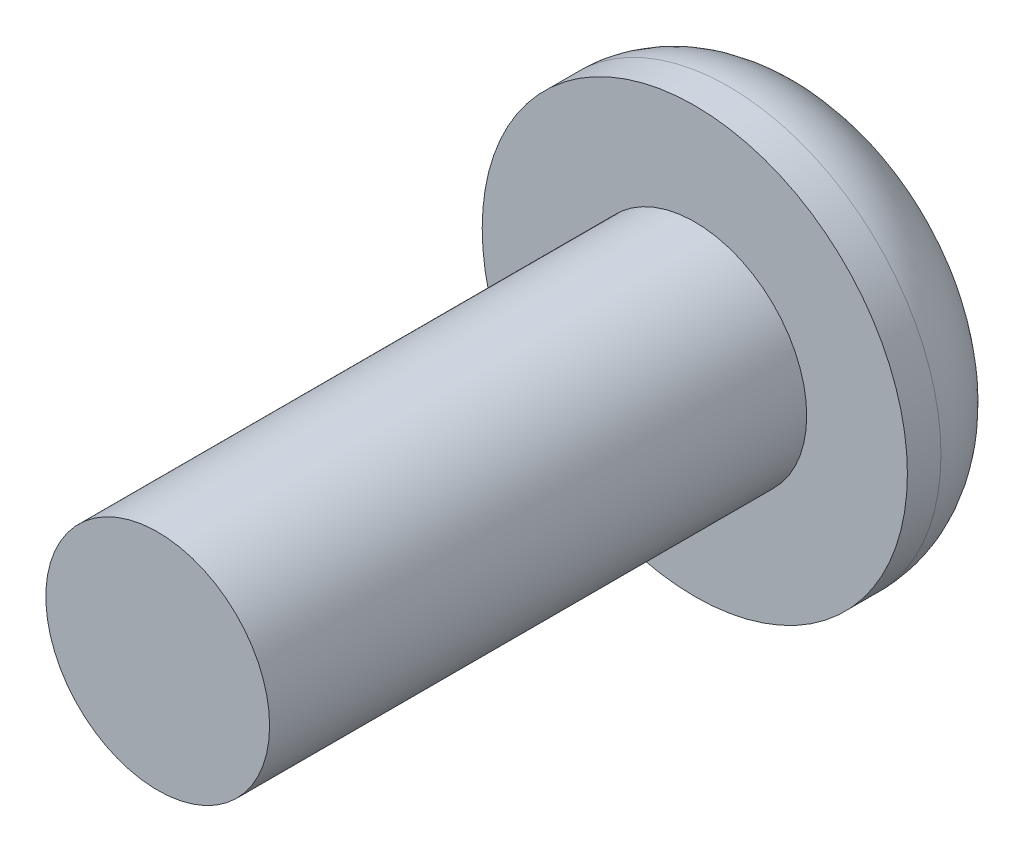
ISO-10303-21;
HEADER;
FILE_DESCRIPTION(('STEP AP214'),'2;1');
FILE_NAME('part.step','',(''),(''),'','','');
FILE_SCHEMA(('AUTOMOTIVE_DESIGN { 1 0 10303 214 1 1 1 1 }'));
ENDSEC;
DATA;
#1=APPLICATION_CONTEXT('core data for automotive mechanical design processes');
#2=APPLICATION_PROTOCOL_DEFINITION('international standard','automotive_design',2000,#1);
#3=PRODUCT_CONTEXT('',#1,'mechanical');
#4=PRODUCT('Part','Part','',(#3));
#5=PRODUCT_RELATED_PRODUCT_CATEGORY('part','',(#4));
#6=PRODUCT_DEFINITION_FORMATION('','',#4);
#7=PRODUCT_DEFINITION_CONTEXT('part definition',#1,'design');
#8=PRODUCT_DEFINITION('design','',#6,#7);
#9=PRODUCT_DEFINITION_SHAPE('','',#8);
#10=(LENGTH_UNIT() NAMED_UNIT(*) SI_UNIT(.MILLI.,.METRE.));
#11=(NAMED_UNIT(*) PLANE_ANGLE_UNIT() SI_UNIT($,.RADIAN.));
#12=(NAMED_UNIT(*) SI_UNIT($,.STERADIAN.) SOLID_ANGLE_UNIT());
#13=UNCERTAINTY_MEASURE_WITH_UNIT(LENGTH_MEASURE(1.E-05),#10,'distance_accuracy_value','');
#14=(GEOMETRIC_REPRESENTATION_CONTEXT(3) GLOBAL_UNCERTAINTY_ASSIGNED_CONTEXT((#13)) GLOBAL_UNIT_ASSIGNED_CONTEXT((#10,
#11,#12)) REPRESENTATION_CONTEXT('',''));
#15=CARTESIAN_POINT('',(0.,0.,0.));
#16=DIRECTION('',(0.,0.,1.));
#17=DIRECTION('',(1.,0.,0.));
#18=AXIS2_PLACEMENT_3D('',#15,#16,#17);
#19=CARTESIAN_POINT('',(0.,0.,12.));
#20=DIRECTION('',(0.,0.,-1.));
#21=DIRECTION('',(-1.,0.,0.));
#22=AXIS2_PLACEMENT_3D('',#19,#20,#21);
#23=CYLINDRICAL_SURFACE('',#22,2.5);
#24=CARTESIAN_POINT('',(0.,0.,12.));
#25=DIRECTION('',(0.,0.,1.));
#26=DIRECTION('',(1.,0.,0.));
#27=AXIS2_PLACEMENT_3D('',#24,#25,#26);
#28=CIRCLE('',#27,2.5);
#29=CARTESIAN_POINT('',(2.5,0.,12.));
#30=VERTEX_POINT('',#29);
#31=EDGE_CURVE('E50',#30,#30,#28,.T.);
#32=ORIENTED_EDGE('',*,*,#31,.F.);
#33=EDGE_LOOP('',(#32));
#34=FACE_BOUND('',#33,.T.);
#35=CARTESIAN_POINT('',(0.,0.,0.));
#36=DIRECTION('',(0.,0.,1.));
#37=DIRECTION('',(1.,0.,0.));
#38=AXIS2_PLACEMENT_3D('',#35,#36,#37);
#39=CIRCLE('',#38,2.5);
#40=CARTESIAN_POINT('',(2.5,0.,0.));
#41=VERTEX_POINT('',#40);
#42=EDGE_CURVE('E55',#41,#41,#39,.T.);
#43=ORIENTED_EDGE('',*,*,#42,.T.);
#44=EDGE_LOOP('',(#43));
#45=FACE_BOUND('',#44,.T.);
#46=ADVANCED_FACE('F37',(#34,#45),#23,.T.);
#47=CARTESIAN_POINT('',(0.,0.,12.));
#48=DIRECTION('',(0.,0.,1.));
#49=DIRECTION('',(1.,0.,0.));
#50=AXIS2_PLACEMENT_3D('',#47,#48,#49);
#51=PLANE('',#50);
#52=ORIENTED_EDGE('',*,*,#31,.T.);
#53=EDGE_LOOP('',(#52));
#54=FACE_BOUND('',#53,.T.);
#55=ADVANCED_FACE('F82',(#54),#51,.T.);
#56=CARTESIAN_POINT('',(0.,0.,-2.75));
#57=DIRECTION('',(0.,0.,1.));
#58=DIRECTION('',(1.,0.,0.));
#59=AXIS2_PLACEMENT_3D('',#56,#57,#58);
#60=CYLINDRICAL_SURFACE('',#59,4.75);
#61=CARTESIAN_POINT('',(0.,0.,-0.75));
#62=DIRECTION('',(0.,0.,-1.));
#63=DIRECTION('',(-1.,0.,0.));
#64=AXIS2_PLACEMENT_3D('',#61,#62,#63);
#65=CIRCLE('',#64,4.75);
#66=CARTESIAN_POINT('',(-4.75,0.,-0.75));
#67=VERTEX_POINT('',#66);
#68=EDGE_CURVE('E10',#67,#67,#65,.F.);
#69=ORIENTED_EDGE('',*,*,#68,.T.);
#70=EDGE_LOOP('',(#69));
#71=FACE_BOUND('',#70,.T.);
#72=CARTESIAN_POINT('',(0.,0.,0.));
#73=DIRECTION('',(0.,0.,-1.));
#74=DIRECTION('',(-1.,0.,0.));
#75=AXIS2_PLACEMENT_3D('',#72,#73,#74);
#76=CIRCLE('',#75,4.75);
#77=CARTESIAN_POINT('',(-4.75,0.,0.));
#78=VERTEX_POINT('',#77);
#79=EDGE_CURVE('E60',#78,#78,#76,.T.);
#80=ORIENTED_EDGE('',*,*,#79,.T.);
#81=EDGE_LOOP('',(#80));
#82=FACE_BOUND('',#81,.T.);
#83=ADVANCED_FACE('F66',(#71,#82),#60,.T.);
#84=CARTESIAN_POINT('',(0.,0.,-2.75));
#85=DIRECTION('',(0.,0.,-1.));
#86=DIRECTION('',(-1.,0.,0.));
#87=AXIS2_PLACEMENT_3D('',#84,#85,#86);
#88=PLANE('',#87);
#89=CARTESIAN_POINT('',(0.,0.,-2.75));
#90=DIRECTION('',(0.,0.,-1.));
#91=DIRECTION('',(-1.,0.,0.));
#92=AXIS2_PLACEMENT_3D('',#89,#90,#91);
#93=CIRCLE('',#92,2.75);
#94=CARTESIAN_POINT('',(-2.75,0.,-2.75));
#95=VERTEX_POINT('',#94);
#96=EDGE_CURVE('E45',#95,#95,#93,.T.);
#97=ORIENTED_EDGE('',*,*,#96,.T.);
#98=EDGE_LOOP('',(#97));
#99=FACE_BOUND('',#98,.T.);
#100=ADVANCED_FACE('F70',(#99),#88,.T.);
#101=CARTESIAN_POINT('',(0.,0.,0.));
#102=DIRECTION('',(0.,0.,-1.));
#103=DIRECTION('',(-1.,0.,0.));
#104=AXIS2_PLACEMENT_3D('',#101,#102,#103);
#105=PLANE('',#104);
#106=ORIENTED_EDGE('',*,*,#42,.F.);
#107=EDGE_LOOP('',(#106));
#108=FACE_BOUND('',#107,.T.);
#109=ORIENTED_EDGE('',*,*,#79,.F.);
#110=EDGE_LOOP('',(#109));
#111=FACE_BOUND('',#110,.T.);
#112=ADVANCED_FACE('F68',(#108,#111),#105,.F.);
#113=CARTESIAN_POINT('',(0.,0.,-0.75));
#114=DIRECTION('',(0.,0.,-1.));
#115=DIRECTION('',(-1.,0.,0.));
#116=AXIS2_PLACEMENT_3D('',#113,#114,#115);
#117=TOROIDAL_SURFACE('',#116,2.75,2.);
#118=ORIENTED_EDGE('',*,*,#68,.F.);
#119=EDGE_LOOP('',(#118));
#120=FACE_BOUND('',#119,.T.);
#121=ORIENTED_EDGE('',*,*,#96,.F.);
#122=EDGE_LOOP('',(#121));
#123=FACE_BOUND('',#122,.T.);
#124=ADVANCED_FACE('F39',(#120,#123),#117,.T.);
#125=CLOSED_SHELL('',(#46,#55,#83,#100,#112,#124));
#126=MANIFOLD_SOLID_BREP('B2',#125);
#127=ADVANCED_BREP_SHAPE_REPRESENTATION('',(#18,#126),#14);
#128=SHAPE_DEFINITION_REPRESENTATION(#9,#127);
ENDSEC;
END-ISO-10303-21;
